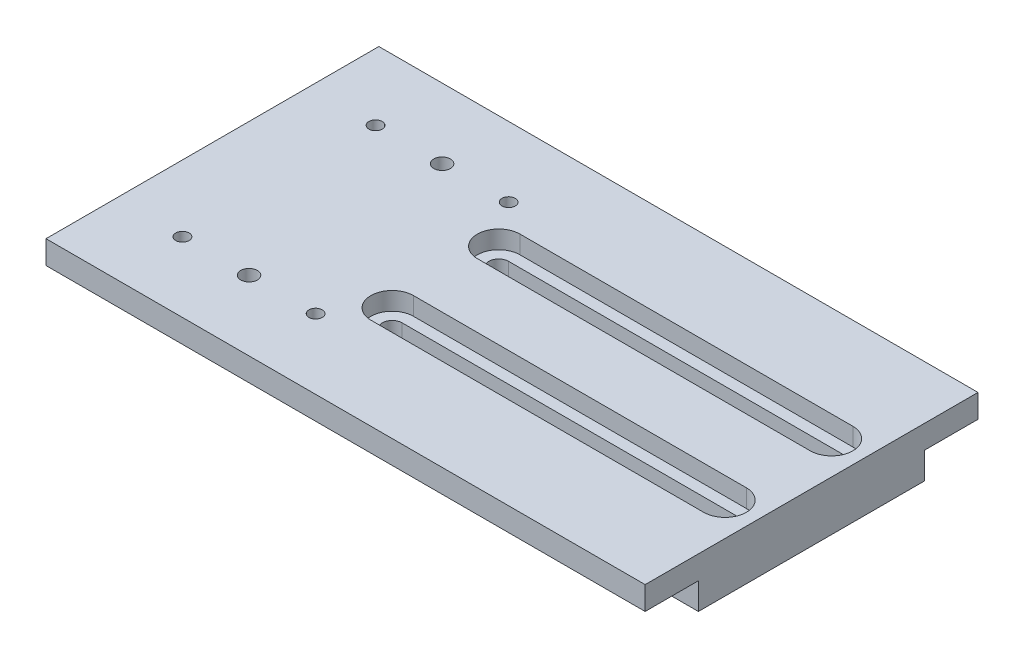
ISO-10303-21;
HEADER;
FILE_DESCRIPTION(('STEP AP214'),'2;1');
FILE_NAME('part.step','',(''),(''),'','','');
FILE_SCHEMA(('AUTOMOTIVE_DESIGN { 1 0 10303 214 1 1 1 1 }'));
ENDSEC;
DATA;
#1=APPLICATION_CONTEXT('core data for automotive mechanical design processes');
#2=APPLICATION_PROTOCOL_DEFINITION('international standard','automotive_design',2000,#1);
#3=PRODUCT_CONTEXT('',#1,'mechanical');
#4=PRODUCT('Part','Part','',(#3));
#5=PRODUCT_RELATED_PRODUCT_CATEGORY('part','',(#4));
#6=PRODUCT_DEFINITION_FORMATION('','',#4);
#7=PRODUCT_DEFINITION_CONTEXT('part definition',#1,'design');
#8=PRODUCT_DEFINITION('design','',#6,#7);
#9=PRODUCT_DEFINITION_SHAPE('','',#8);
#10=(LENGTH_UNIT() NAMED_UNIT(*) SI_UNIT(.MILLI.,.METRE.));
#11=(NAMED_UNIT(*) PLANE_ANGLE_UNIT() SI_UNIT($,.RADIAN.));
#12=(NAMED_UNIT(*) SI_UNIT($,.STERADIAN.) SOLID_ANGLE_UNIT());
#13=UNCERTAINTY_MEASURE_WITH_UNIT(LENGTH_MEASURE(1.E-05),#10,'distance_accuracy_value','');
#14=(GEOMETRIC_REPRESENTATION_CONTEXT(3) GLOBAL_UNCERTAINTY_ASSIGNED_CONTEXT((#13)) GLOBAL_UNIT_ASSIGNED_CONTEXT((#10,
#11,#12)) REPRESENTATION_CONTEXT('',''));
#15=CARTESIAN_POINT('',(0.,0.,0.));
#16=DIRECTION('',(0.,0.,1.));
#17=DIRECTION('',(1.,0.,0.));
#18=AXIS2_PLACEMENT_3D('',#15,#16,#17);
#19=CARTESIAN_POINT('',(0.,7.5,0.));
#20=DIRECTION('',(0.,-1.,0.));
#21=DIRECTION('',(0.,0.,-1.));
#22=AXIS2_PLACEMENT_3D('',#19,#20,#21);
#23=PLANE('',#22);
#24=CARTESIAN_POINT('',(-25.,7.5,-14.5));
#25=DIRECTION('',(0.,1.,0.));
#26=DIRECTION('',(0.,0.,1.));
#27=AXIS2_PLACEMENT_3D('',#24,#25,#26);
#28=CIRCLE('',#27,1.24999999999999);
#29=CARTESIAN_POINT('',(-25.,7.5,-13.25));
#30=VERTEX_POINT('',#29);
#31=EDGE_CURVE('E886',#30,#30,#28,.T.);
#32=ORIENTED_EDGE('',*,*,#31,.F.);
#33=EDGE_LOOP('',(#32));
#34=FACE_BOUND('',#33,.T.);
#35=DIRECTION('',(1.,0.,0.));
#36=VECTOR('',#35,1.);
#37=CARTESIAN_POINT('',(-9.99999999999999,7.5,-4.8));
#38=LINE('',#37,#36);
#39=CARTESIAN_POINT('',(-9.99999999999999,7.5,-4.8));
#40=VERTEX_POINT('',#39);
#41=CARTESIAN_POINT('',(40.,7.5,-4.79999999999999));
#42=VERTEX_POINT('',#41);
#43=EDGE_CURVE('E283',#40,#42,#38,.T.);
#44=ORIENTED_EDGE('',*,*,#43,.F.);
#45=CARTESIAN_POINT('',(-9.99999999999999,7.5,-8.));
#46=DIRECTION('',(0.,1.,0.));
#47=DIRECTION('',(0.,0.,1.));
#48=AXIS2_PLACEMENT_3D('',#45,#46,#47);
#49=CIRCLE('',#48,3.2);
#50=CARTESIAN_POINT('',(-9.99999999999999,7.5,-11.2));
#51=VERTEX_POINT('',#50);
#52=EDGE_CURVE('E280',#51,#40,#49,.T.);
#53=ORIENTED_EDGE('',*,*,#52,.F.);
#54=DIRECTION('',(-1.,0.,0.));
#55=VECTOR('',#54,1.);
#56=CARTESIAN_POINT('',(-9.99999999999999,7.5,-11.2));
#57=LINE('',#56,#55);
#58=CARTESIAN_POINT('',(40.,7.5,-11.2));
#59=VERTEX_POINT('',#58);
#60=EDGE_CURVE('E267',#59,#51,#57,.T.);
#61=ORIENTED_EDGE('',*,*,#60,.F.);
#62=CARTESIAN_POINT('',(40.,7.5,-7.99999999999999));
#63=DIRECTION('',(0.,1.,0.));
#64=DIRECTION('',(0.,0.,1.));
#65=AXIS2_PLACEMENT_3D('',#62,#63,#64);
#66=CIRCLE('',#65,3.2);
#67=EDGE_CURVE('E288',#42,#59,#66,.T.);
#68=ORIENTED_EDGE('',*,*,#67,.F.);
#69=EDGE_LOOP('',(#44,#53,#61,#68));
#70=FACE_BOUND('',#69,.T.);
#71=DIRECTION('',(1.,0.,0.));
#72=VECTOR('',#71,1.);
#73=CARTESIAN_POINT('',(-9.99999999999999,7.5,11.2));
#74=LINE('',#73,#72);
#75=CARTESIAN_POINT('',(-9.99999999999999,7.5,11.2));
#76=VERTEX_POINT('',#75);
#77=CARTESIAN_POINT('',(40.,7.5,11.2));
#78=VERTEX_POINT('',#77);
#79=EDGE_CURVE('E328',#76,#78,#74,.T.);
#80=ORIENTED_EDGE('',*,*,#79,.F.);
#81=CARTESIAN_POINT('',(-9.99999999999999,7.5,8.));
#82=DIRECTION('',(0.,1.,0.));
#83=DIRECTION('',(0.,0.,-1.));
#84=AXIS2_PLACEMENT_3D('',#81,#82,#83);
#85=CIRCLE('',#84,3.2);
#86=CARTESIAN_POINT('',(-9.99999999999999,7.5,4.8));
#87=VERTEX_POINT('',#86);
#88=EDGE_CURVE('E261',#87,#76,#85,.T.);
#89=ORIENTED_EDGE('',*,*,#88,.F.);
#90=DIRECTION('',(-1.,0.,0.));
#91=VECTOR('',#90,1.);
#92=CARTESIAN_POINT('',(-9.99999999999999,7.5,4.8));
#93=LINE('',#92,#91);
#94=CARTESIAN_POINT('',(40.,7.5,4.79999999999999));
#95=VERTEX_POINT('',#94);
#96=EDGE_CURVE('E313',#95,#87,#93,.T.);
#97=ORIENTED_EDGE('',*,*,#96,.F.);
#98=CARTESIAN_POINT('',(40.,7.5,7.99999999999999));
#99=DIRECTION('',(0.,1.,0.));
#100=DIRECTION('',(0.,0.,-1.));
#101=AXIS2_PLACEMENT_3D('',#98,#99,#100);
#102=CIRCLE('',#101,3.2);
#103=EDGE_CURVE('E332',#78,#95,#102,.T.);
#104=ORIENTED_EDGE('',*,*,#103,.F.);
#105=EDGE_LOOP('',(#80,#89,#97,#104));
#106=FACE_BOUND('',#105,.T.);
#107=CARTESIAN_POINT('',(-35.,7.5,-14.5));
#108=DIRECTION('',(0.,1.,0.));
#109=DIRECTION('',(0.,0.,1.));
#110=AXIS2_PLACEMENT_3D('',#107,#108,#109);
#111=CIRCLE('',#110,0.999999999999998);
#112=CARTESIAN_POINT('',(-35.,7.5,-13.5));
#113=VERTEX_POINT('',#112);
#114=EDGE_CURVE('E375',#113,#113,#111,.T.);
#115=ORIENTED_EDGE('',*,*,#114,.F.);
#116=EDGE_LOOP('',(#115));
#117=FACE_BOUND('',#116,.T.);
#118=CARTESIAN_POINT('',(-15.,7.5,14.5));
#119=DIRECTION('',(0.,1.,0.));
#120=DIRECTION('',(0.,0.,-1.));
#121=AXIS2_PLACEMENT_3D('',#118,#119,#120);
#122=CIRCLE('',#121,1.);
#123=CARTESIAN_POINT('',(-15.,7.5,13.5));
#124=VERTEX_POINT('',#123);
#125=EDGE_CURVE('E424',#124,#124,#122,.T.);
#126=ORIENTED_EDGE('',*,*,#125,.F.);
#127=EDGE_LOOP('',(#126));
#128=FACE_BOUND('',#127,.T.);
#129=CARTESIAN_POINT('',(-15.,7.5,-14.5));
#130=DIRECTION('',(0.,1.,0.));
#131=DIRECTION('',(0.,0.,1.));
#132=AXIS2_PLACEMENT_3D('',#129,#130,#131);
#133=CIRCLE('',#132,1.);
#134=CARTESIAN_POINT('',(-15.,7.5,-13.5));
#135=VERTEX_POINT('',#134);
#136=EDGE_CURVE('E370',#135,#135,#133,.T.);
#137=ORIENTED_EDGE('',*,*,#136,.F.);
#138=EDGE_LOOP('',(#137));
#139=FACE_BOUND('',#138,.T.);
#140=CARTESIAN_POINT('',(-35.,7.5,14.5));
#141=DIRECTION('',(0.,1.,0.));
#142=DIRECTION('',(0.,0.,-1.));
#143=AXIS2_PLACEMENT_3D('',#140,#141,#142);
#144=CIRCLE('',#143,0.999999999999998);
#145=CARTESIAN_POINT('',(-35.,7.5,13.5));
#146=VERTEX_POINT('',#145);
#147=EDGE_CURVE('E423',#146,#146,#144,.T.);
#148=ORIENTED_EDGE('',*,*,#147,.F.);
#149=EDGE_LOOP('',(#148));
#150=FACE_BOUND('',#149,.T.);
#151=DIRECTION('',(0.,0.,-1.));
#152=VECTOR('',#151,1.);
#153=CARTESIAN_POINT('',(45.,7.5,25.));
#154=LINE('',#153,#152);
#155=CARTESIAN_POINT('',(45.,7.5,25.));
#156=VERTEX_POINT('',#155);
#157=CARTESIAN_POINT('',(45.,7.5,-25.));
#158=VERTEX_POINT('',#157);
#159=EDGE_CURVE('E466',#156,#158,#154,.T.);
#160=ORIENTED_EDGE('',*,*,#159,.T.);
#161=DIRECTION('',(-1.,0.,0.));
#162=VECTOR('',#161,1.);
#163=CARTESIAN_POINT('',(-45.,7.5,-25.));
#164=LINE('',#163,#162);
#165=CARTESIAN_POINT('',(-45.,7.5,-25.));
#166=VERTEX_POINT('',#165);
#167=EDGE_CURVE('E470',#158,#166,#164,.T.);
#168=ORIENTED_EDGE('',*,*,#167,.T.);
#169=DIRECTION('',(0.,0.,1.));
#170=VECTOR('',#169,1.);
#171=CARTESIAN_POINT('',(-45.,7.5,25.));
#172=LINE('',#171,#170);
#173=CARTESIAN_POINT('',(-45.,7.5,25.));
#174=VERTEX_POINT('',#173);
#175=EDGE_CURVE('E474',#166,#174,#172,.T.);
#176=ORIENTED_EDGE('',*,*,#175,.T.);
#177=DIRECTION('',(1.,0.,0.));
#178=VECTOR('',#177,1.);
#179=CARTESIAN_POINT('',(-45.,7.5,25.));
#180=LINE('',#179,#178);
#181=EDGE_CURVE('E477',#174,#156,#180,.T.);
#182=ORIENTED_EDGE('',*,*,#181,.T.);
#183=EDGE_LOOP('',(#160,#168,#176,#182));
#184=FACE_BOUND('',#183,.T.);
#185=CARTESIAN_POINT('',(-25.,7.5,14.5));
#186=DIRECTION('',(0.,1.,0.));
#187=DIRECTION('',(0.,0.,1.));
#188=AXIS2_PLACEMENT_3D('',#185,#186,#187);
#189=CIRCLE('',#188,1.24999999999999);
#190=CARTESIAN_POINT('',(-25.,7.5,15.75));
#191=VERTEX_POINT('',#190);
#192=EDGE_CURVE('E890',#191,#191,#189,.T.);
#193=ORIENTED_EDGE('',*,*,#192,.F.);
#194=EDGE_LOOP('',(#193));
#195=FACE_BOUND('',#194,.T.);
#196=ADVANCED_FACE('F43',(#34,#70,#106,#117,#128,#139,#150,#184,#195),#23,.F.);
#197=CARTESIAN_POINT('',(-9.99999999999999,0.,-8.));
#198=DIRECTION('',(0.,1.,0.));
#199=DIRECTION('',(0.,0.,1.));
#200=AXIS2_PLACEMENT_3D('',#197,#198,#199);
#201=CYLINDRICAL_SURFACE('',#200,1.5);
#202=CARTESIAN_POINT('',(-9.99999999999999,4.8,-8.));
#203=DIRECTION('',(0.,1.,0.));
#204=DIRECTION('',(0.,0.,1.));
#205=AXIS2_PLACEMENT_3D('',#202,#203,#204);
#206=CIRCLE('',#205,1.5);
#207=CARTESIAN_POINT('',(-9.99999999999999,4.8,-6.5));
#208=VERTEX_POINT('',#207);
#209=CARTESIAN_POINT('',(-9.99999999999999,4.8,-9.5));
#210=VERTEX_POINT('',#209);
#211=EDGE_CURVE('E367',#208,#210,#206,.F.);
#212=ORIENTED_EDGE('',*,*,#211,.F.);
#213=DIRECTION('',(0.,1.,0.));
#214=VECTOR('',#213,1.);
#215=CARTESIAN_POINT('',(-9.99999999999999,0.,-6.5));
#216=LINE('',#215,#214);
#217=CARTESIAN_POINT('',(-9.99999999999999,0.,-6.5));
#218=VERTEX_POINT('',#217);
#219=EDGE_CURVE('E444',#218,#208,#216,.T.);
#220=ORIENTED_EDGE('',*,*,#219,.F.);
#221=CARTESIAN_POINT('',(-9.99999999999999,0.,-8.));
#222=DIRECTION('',(0.,1.,0.));
#223=DIRECTION('',(0.,0.,1.));
#224=AXIS2_PLACEMENT_3D('',#221,#222,#223);
#225=CIRCLE('',#224,1.5);
#226=CARTESIAN_POINT('',(-9.99999999999999,0.,-9.5));
#227=VERTEX_POINT('',#226);
#228=EDGE_CURVE('E401',#227,#218,#225,.T.);
#229=ORIENTED_EDGE('',*,*,#228,.F.);
#230=DIRECTION('',(0.,1.,0.));
#231=VECTOR('',#230,1.);
#232=CARTESIAN_POINT('',(-9.99999999999999,0.,-9.5));
#233=LINE('',#232,#231);
#234=EDGE_CURVE('E428',#227,#210,#233,.T.);
#235=ORIENTED_EDGE('',*,*,#234,.T.);
#236=EDGE_LOOP('',(#212,#220,#229,#235));
#237=FACE_BOUND('',#236,.T.);
#238=ADVANCED_FACE('F513',(#237),#201,.F.);
#239=CARTESIAN_POINT('',(-9.99999999999999,0.,-9.5));
#240=DIRECTION('',(0.,0.,-1.));
#241=DIRECTION('',(-1.,0.,0.));
#242=AXIS2_PLACEMENT_3D('',#239,#240,#241);
#243=PLANE('',#242);
#244=DIRECTION('',(1.,0.,0.));
#245=VECTOR('',#244,1.);
#246=CARTESIAN_POINT('',(-9.99999999999999,4.8,-9.5));
#247=LINE('',#246,#245);
#248=CARTESIAN_POINT('',(40.,4.8,-9.49999999999997));
#249=VERTEX_POINT('',#248);
#250=EDGE_CURVE('E364',#210,#249,#247,.T.);
#251=ORIENTED_EDGE('',*,*,#250,.F.);
#252=ORIENTED_EDGE('',*,*,#234,.F.);
#253=DIRECTION('',(-1.,0.,0.));
#254=VECTOR('',#253,1.);
#255=CARTESIAN_POINT('',(-9.99999999999999,0.,-9.5));
#256=LINE('',#255,#254);
#257=CARTESIAN_POINT('',(40.,0.,-9.49999999999999));
#258=VERTEX_POINT('',#257);
#259=EDGE_CURVE('E440',#258,#227,#256,.T.);
#260=ORIENTED_EDGE('',*,*,#259,.F.);
#261=DIRECTION('',(0.,1.,0.));
#262=VECTOR('',#261,1.);
#263=CARTESIAN_POINT('',(40.,0.,-9.49999999999999));
#264=LINE('',#263,#262);
#265=EDGE_CURVE('E448',#258,#249,#264,.T.);
#266=ORIENTED_EDGE('',*,*,#265,.T.);
#267=EDGE_LOOP('',(#251,#252,#260,#266));
#268=FACE_BOUND('',#267,.T.);
#269=ADVANCED_FACE('F522',(#268),#243,.F.);
#270=CARTESIAN_POINT('',(40.,0.,-7.99999999999999));
#271=DIRECTION('',(0.,1.,0.));
#272=DIRECTION('',(0.,0.,1.));
#273=AXIS2_PLACEMENT_3D('',#270,#271,#272);
#274=CYLINDRICAL_SURFACE('',#273,1.49999999999998);
#275=CARTESIAN_POINT('',(40.,4.8,-7.99999999999999));
#276=DIRECTION('',(0.,1.,0.));
#277=DIRECTION('',(0.,0.,1.));
#278=AXIS2_PLACEMENT_3D('',#275,#276,#277);
#279=CIRCLE('',#278,1.49999999999998);
#280=CARTESIAN_POINT('',(40.,4.8,-6.50000000000001));
#281=VERTEX_POINT('',#280);
#282=EDGE_CURVE('E361',#249,#281,#279,.F.);
#283=ORIENTED_EDGE('',*,*,#282,.F.);
#284=ORIENTED_EDGE('',*,*,#265,.F.);
#285=CARTESIAN_POINT('',(40.,0.,-7.99999999999999));
#286=DIRECTION('',(0.,1.,0.));
#287=DIRECTION('',(0.,0.,1.));
#288=AXIS2_PLACEMENT_3D('',#285,#286,#287);
#289=CIRCLE('',#288,1.49999999999998);
#290=CARTESIAN_POINT('',(40.,0.,-6.50000000000002));
#291=VERTEX_POINT('',#290);
#292=EDGE_CURVE('E436',#291,#258,#289,.T.);
#293=ORIENTED_EDGE('',*,*,#292,.F.);
#294=DIRECTION('',(0.,1.,0.));
#295=VECTOR('',#294,1.);
#296=CARTESIAN_POINT('',(40.,0.,-6.50000000000001));
#297=LINE('',#296,#295);
#298=EDGE_CURVE('E452',#291,#281,#297,.T.);
#299=ORIENTED_EDGE('',*,*,#298,.T.);
#300=EDGE_LOOP('',(#283,#284,#293,#299));
#301=FACE_BOUND('',#300,.T.);
#302=ADVANCED_FACE('F524',(#301),#274,.F.);
#303=CARTESIAN_POINT('',(-9.99999999999999,0.,-6.5));
#304=DIRECTION('',(0.,0.,1.));
#305=DIRECTION('',(1.,0.,0.));
#306=AXIS2_PLACEMENT_3D('',#303,#304,#305);
#307=PLANE('',#306);
#308=DIRECTION('',(-1.,0.,0.));
#309=VECTOR('',#308,1.);
#310=CARTESIAN_POINT('',(-9.99999999999999,4.8,-6.5));
#311=LINE('',#310,#309);
#312=EDGE_CURVE('E52',#281,#208,#311,.T.);
#313=ORIENTED_EDGE('',*,*,#312,.F.);
#314=ORIENTED_EDGE('',*,*,#298,.F.);
#315=DIRECTION('',(1.,0.,0.));
#316=VECTOR('',#315,1.);
#317=CARTESIAN_POINT('',(-9.99999999999999,0.,-6.5));
#318=LINE('',#317,#316);
#319=EDGE_CURVE('E432',#218,#291,#318,.T.);
#320=ORIENTED_EDGE('',*,*,#319,.F.);
#321=ORIENTED_EDGE('',*,*,#219,.T.);
#322=EDGE_LOOP('',(#313,#314,#320,#321));
#323=FACE_BOUND('',#322,.T.);
#324=ADVANCED_FACE('F516',(#323),#307,.F.);
#325=CARTESIAN_POINT('',(45.,7.5,25.));
#326=DIRECTION('',(-1.,0.,0.));
#327=DIRECTION('',(0.,0.,1.));
#328=AXIS2_PLACEMENT_3D('',#325,#326,#327);
#329=PLANE('',#328);
#330=DIRECTION('',(0.,0.,-1.));
#331=VECTOR('',#330,1.);
#332=CARTESIAN_POINT('',(45.,0.,25.));
#333=LINE('',#332,#331);
#334=CARTESIAN_POINT('',(45.,0.,17.));
#335=VERTEX_POINT('',#334);
#336=CARTESIAN_POINT('',(45.,0.,-17.));
#337=VERTEX_POINT('',#336);
#338=EDGE_CURVE('E227',#335,#337,#333,.T.);
#339=ORIENTED_EDGE('',*,*,#338,.T.);
#340=DIRECTION('',(0.,1.,0.));
#341=VECTOR('',#340,1.);
#342=CARTESIAN_POINT('',(45.,0.,-17.));
#343=LINE('',#342,#341);
#344=CARTESIAN_POINT('',(45.,4.,-17.));
#345=VERTEX_POINT('',#344);
#346=EDGE_CURVE('E67',#337,#345,#343,.T.);
#347=ORIENTED_EDGE('',*,*,#346,.T.);
#348=DIRECTION('',(0.,0.,-1.));
#349=VECTOR('',#348,1.);
#350=CARTESIAN_POINT('',(45.,4.,-17.));
#351=LINE('',#350,#349);
#352=CARTESIAN_POINT('',(45.,4.,-25.));
#353=VERTEX_POINT('',#352);
#354=EDGE_CURVE('E213',#345,#353,#351,.T.);
#355=ORIENTED_EDGE('',*,*,#354,.T.);
#356=DIRECTION('',(0.,-1.,0.));
#357=VECTOR('',#356,1.);
#358=CARTESIAN_POINT('',(45.,7.5,-25.));
#359=LINE('',#358,#357);
#360=EDGE_CURVE('E497',#158,#353,#359,.T.);
#361=ORIENTED_EDGE('',*,*,#360,.F.);
#362=ORIENTED_EDGE('',*,*,#159,.F.);
#363=DIRECTION('',(0.,-1.,0.));
#364=VECTOR('',#363,1.);
#365=CARTESIAN_POINT('',(45.,7.5,25.));
#366=LINE('',#365,#364);
#367=CARTESIAN_POINT('',(45.,4.,25.));
#368=VERTEX_POINT('',#367);
#369=EDGE_CURVE('E480',#156,#368,#366,.T.);
#370=ORIENTED_EDGE('',*,*,#369,.T.);
#371=DIRECTION('',(0.,0.,-1.));
#372=VECTOR('',#371,1.);
#373=CARTESIAN_POINT('',(45.,4.,17.));
#374=LINE('',#373,#372);
#375=CARTESIAN_POINT('',(45.,4.,17.));
#376=VERTEX_POINT('',#375);
#377=EDGE_CURVE('E242',#368,#376,#374,.T.);
#378=ORIENTED_EDGE('',*,*,#377,.T.);
#379=DIRECTION('',(0.,-1.,0.));
#380=VECTOR('',#379,1.);
#381=CARTESIAN_POINT('',(45.,0.,17.));
#382=LINE('',#381,#380);
#383=EDGE_CURVE('E246',#376,#335,#382,.T.);
#384=ORIENTED_EDGE('',*,*,#383,.T.);
#385=EDGE_LOOP('',(#339,#347,#355,#361,#362,#370,#378,#384));
#386=FACE_BOUND('',#385,.T.);
#387=ADVANCED_FACE('F45',(#386),#329,.F.);
#388=CARTESIAN_POINT('',(-45.,7.5,-25.));
#389=DIRECTION('',(0.,0.,1.));
#390=DIRECTION('',(1.,0.,0.));
#391=AXIS2_PLACEMENT_3D('',#388,#389,#390);
#392=PLANE('',#391);
#393=ORIENTED_EDGE('',*,*,#360,.T.);
#394=DIRECTION('',(-1.,0.,0.));
#395=VECTOR('',#394,1.);
#396=CARTESIAN_POINT('',(-45.,4.,-25.));
#397=LINE('',#396,#395);
#398=CARTESIAN_POINT('',(-45.,4.,-25.));
#399=VERTEX_POINT('',#398);
#400=EDGE_CURVE('E218',#353,#399,#397,.T.);
#401=ORIENTED_EDGE('',*,*,#400,.T.);
#402=DIRECTION('',(0.,-1.,0.));
#403=VECTOR('',#402,1.);
#404=CARTESIAN_POINT('',(-45.,7.5,-25.));
#405=LINE('',#404,#403);
#406=EDGE_CURVE('E493',#166,#399,#405,.T.);
#407=ORIENTED_EDGE('',*,*,#406,.F.);
#408=ORIENTED_EDGE('',*,*,#167,.F.);
#409=EDGE_LOOP('',(#393,#401,#407,#408));
#410=FACE_BOUND('',#409,.T.);
#411=ADVANCED_FACE('F554',(#410),#392,.F.);
#412=CARTESIAN_POINT('',(-45.,7.5,25.));
#413=DIRECTION('',(1.,0.,0.));
#414=DIRECTION('',(0.,0.,-1.));
#415=AXIS2_PLACEMENT_3D('',#412,#413,#414);
#416=PLANE('',#415);
#417=DIRECTION('',(0.,0.,-1.));
#418=VECTOR('',#417,1.);
#419=CARTESIAN_POINT('',(-45.,4.,-17.));
#420=LINE('',#419,#418);
#421=CARTESIAN_POINT('',(-45.,4.,-17.));
#422=VERTEX_POINT('',#421);
#423=EDGE_CURVE('E229',#422,#399,#420,.T.);
#424=ORIENTED_EDGE('',*,*,#423,.F.);
#425=DIRECTION('',(0.,1.,0.));
#426=VECTOR('',#425,1.);
#427=CARTESIAN_POINT('',(-45.,0.,-17.));
#428=LINE('',#427,#426);
#429=CARTESIAN_POINT('',(-45.,0.,-17.));
#430=VERTEX_POINT('',#429);
#431=EDGE_CURVE('E208',#430,#422,#428,.T.);
#432=ORIENTED_EDGE('',*,*,#431,.F.);
#433=DIRECTION('',(0.,0.,1.));
#434=VECTOR('',#433,1.);
#435=CARTESIAN_POINT('',(-45.,0.,25.));
#436=LINE('',#435,#434);
#437=CARTESIAN_POINT('',(-45.,0.,17.));
#438=VERTEX_POINT('',#437);
#439=EDGE_CURVE('E471',#430,#438,#436,.T.);
#440=ORIENTED_EDGE('',*,*,#439,.T.);
#441=DIRECTION('',(0.,-1.,0.));
#442=VECTOR('',#441,1.);
#443=CARTESIAN_POINT('',(-45.,0.,17.));
#444=LINE('',#443,#442);
#445=CARTESIAN_POINT('',(-45.,4.,17.));
#446=VERTEX_POINT('',#445);
#447=EDGE_CURVE('E59',#446,#438,#444,.T.);
#448=ORIENTED_EDGE('',*,*,#447,.F.);
#449=DIRECTION('',(0.,0.,-1.));
#450=VECTOR('',#449,1.);
#451=CARTESIAN_POINT('',(-45.,4.,17.));
#452=LINE('',#451,#450);
#453=CARTESIAN_POINT('',(-45.,4.,25.));
#454=VERTEX_POINT('',#453);
#455=EDGE_CURVE('E250',#454,#446,#452,.T.);
#456=ORIENTED_EDGE('',*,*,#455,.F.);
#457=DIRECTION('',(0.,-1.,0.));
#458=VECTOR('',#457,1.);
#459=CARTESIAN_POINT('',(-45.,7.5,25.));
#460=LINE('',#459,#458);
#461=EDGE_CURVE('E489',#174,#454,#460,.T.);
#462=ORIENTED_EDGE('',*,*,#461,.F.);
#463=ORIENTED_EDGE('',*,*,#175,.F.);
#464=ORIENTED_EDGE('',*,*,#406,.T.);
#465=EDGE_LOOP('',(#424,#432,#440,#448,#456,#462,#463,#464));
#466=FACE_BOUND('',#465,.T.);
#467=ADVANCED_FACE('F551',(#466),#416,.F.);
#468=CARTESIAN_POINT('',(-45.,7.5,25.));
#469=DIRECTION('',(0.,0.,-1.));
#470=DIRECTION('',(-1.,0.,0.));
#471=AXIS2_PLACEMENT_3D('',#468,#469,#470);
#472=PLANE('',#471);
#473=ORIENTED_EDGE('',*,*,#461,.T.);
#474=DIRECTION('',(1.,0.,0.));
#475=VECTOR('',#474,1.);
#476=CARTESIAN_POINT('',(-45.,4.,25.));
#477=LINE('',#476,#475);
#478=EDGE_CURVE('E11',#454,#368,#477,.T.);
#479=ORIENTED_EDGE('',*,*,#478,.T.);
#480=ORIENTED_EDGE('',*,*,#369,.F.);
#481=ORIENTED_EDGE('',*,*,#181,.F.);
#482=EDGE_LOOP('',(#473,#479,#480,#481));
#483=FACE_BOUND('',#482,.T.);
#484=ADVANCED_FACE('F547',(#483),#472,.F.);
#485=CARTESIAN_POINT('',(0.,0.,0.));
#486=DIRECTION('',(0.,-1.,0.));
#487=DIRECTION('',(0.,0.,-1.));
#488=AXIS2_PLACEMENT_3D('',#485,#486,#487);
#489=PLANE('',#488);
#490=CARTESIAN_POINT('',(-25.,0.,-14.5));
#491=DIRECTION('',(0.,1.,0.));
#492=DIRECTION('',(0.,0.,1.));
#493=AXIS2_PLACEMENT_3D('',#490,#491,#492);
#494=CIRCLE('',#493,1.25);
#495=CARTESIAN_POINT('',(-25.,0.,-13.25));
#496=VERTEX_POINT('',#495);
#497=EDGE_CURVE('E884',#496,#496,#494,.T.);
#498=ORIENTED_EDGE('',*,*,#497,.T.);
#499=EDGE_LOOP('',(#498));
#500=FACE_BOUND('',#499,.T.);
#501=CARTESIAN_POINT('',(-25.,0.,14.5));
#502=DIRECTION('',(0.,1.,0.));
#503=DIRECTION('',(0.,0.,1.));
#504=AXIS2_PLACEMENT_3D('',#501,#502,#503);
#505=CIRCLE('',#504,1.25);
#506=CARTESIAN_POINT('',(-25.,0.,15.75));
#507=VERTEX_POINT('',#506);
#508=EDGE_CURVE('E234',#507,#507,#505,.T.);
#509=ORIENTED_EDGE('',*,*,#508,.T.);
#510=EDGE_LOOP('',(#509));
#511=FACE_BOUND('',#510,.T.);
#512=DIRECTION('',(-1.,0.,0.));
#513=VECTOR('',#512,1.);
#514=CARTESIAN_POINT('',(45.,0.,-17.));
#515=LINE('',#514,#513);
#516=EDGE_CURVE('E212',#337,#430,#515,.T.);
#517=ORIENTED_EDGE('',*,*,#516,.F.);
#518=ORIENTED_EDGE('',*,*,#338,.F.);
#519=DIRECTION('',(-1.,0.,0.));
#520=VECTOR('',#519,1.);
#521=CARTESIAN_POINT('',(45.,0.,17.));
#522=LINE('',#521,#520);
#523=EDGE_CURVE('E238',#335,#438,#522,.T.);
#524=ORIENTED_EDGE('',*,*,#523,.T.);
#525=ORIENTED_EDGE('',*,*,#439,.F.);
#526=EDGE_LOOP('',(#517,#518,#524,#525));
#527=FACE_BOUND('',#526,.T.);
#528=CARTESIAN_POINT('',(-35.,0.,-14.5));
#529=DIRECTION('',(0.,1.,0.));
#530=DIRECTION('',(0.,0.,1.));
#531=AXIS2_PLACEMENT_3D('',#528,#529,#530);
#532=CIRCLE('',#531,0.999999999999998);
#533=CARTESIAN_POINT('',(-35.,0.,-13.5));
#534=VERTEX_POINT('',#533);
#535=EDGE_CURVE('E384',#534,#534,#532,.T.);
#536=ORIENTED_EDGE('',*,*,#535,.T.);
#537=EDGE_LOOP('',(#536));
#538=FACE_BOUND('',#537,.T.);
#539=CARTESIAN_POINT('',(-9.99999999999999,0.,8.));
#540=DIRECTION('',(0.,1.,0.));
#541=DIRECTION('',(0.,0.,-1.));
#542=AXIS2_PLACEMENT_3D('',#539,#540,#541);
#543=CIRCLE('',#542,1.5);
#544=CARTESIAN_POINT('',(-9.99999999999999,0.,6.5));
#545=VERTEX_POINT('',#544);
#546=CARTESIAN_POINT('',(-9.99999999999999,0.,9.50000000000001));
#547=VERTEX_POINT('',#546);
#548=EDGE_CURVE('E379',#545,#547,#543,.T.);
#549=ORIENTED_EDGE('',*,*,#548,.T.);
#550=DIRECTION('',(1.,0.,0.));
#551=VECTOR('',#550,1.);
#552=CARTESIAN_POINT('',(-9.99999999999999,0.,9.50000000000001));
#553=LINE('',#552,#551);
#554=CARTESIAN_POINT('',(40.,0.,9.49999999999998));
#555=VERTEX_POINT('',#554);
#556=EDGE_CURVE('E383',#547,#555,#553,.T.);
#557=ORIENTED_EDGE('',*,*,#556,.T.);
#558=CARTESIAN_POINT('',(40.,0.,7.99999999999998));
#559=DIRECTION('',(0.,1.,0.));
#560=DIRECTION('',(0.,0.,-1.));
#561=AXIS2_PLACEMENT_3D('',#558,#559,#560);
#562=CIRCLE('',#561,1.49999999999998);
#563=CARTESIAN_POINT('',(40.,0.,6.5));
#564=VERTEX_POINT('',#563);
#565=EDGE_CURVE('E388',#555,#564,#562,.T.);
#566=ORIENTED_EDGE('',*,*,#565,.T.);
#567=DIRECTION('',(-1.,0.,0.));
#568=VECTOR('',#567,1.);
#569=CARTESIAN_POINT('',(-9.99999999999999,0.,6.5));
#570=LINE('',#569,#568);
#571=EDGE_CURVE('E392',#564,#545,#570,.T.);
#572=ORIENTED_EDGE('',*,*,#571,.T.);
#573=EDGE_LOOP('',(#549,#557,#566,#572));
#574=FACE_BOUND('',#573,.T.);
#575=ORIENTED_EDGE('',*,*,#228,.T.);
#576=ORIENTED_EDGE('',*,*,#319,.T.);
#577=ORIENTED_EDGE('',*,*,#292,.T.);
#578=ORIENTED_EDGE('',*,*,#259,.T.);
#579=EDGE_LOOP('',(#575,#576,#577,#578));
#580=FACE_BOUND('',#579,.T.);
#581=CARTESIAN_POINT('',(-15.,0.,14.5));
#582=DIRECTION('',(0.,1.,0.));
#583=DIRECTION('',(0.,0.,-1.));
#584=AXIS2_PLACEMENT_3D('',#581,#582,#583);
#585=CIRCLE('',#584,1.);
#586=CARTESIAN_POINT('',(-15.,0.,13.5));
#587=VERTEX_POINT('',#586);
#588=EDGE_CURVE('E419',#587,#587,#585,.T.);
#589=ORIENTED_EDGE('',*,*,#588,.T.);
#590=EDGE_LOOP('',(#589));
#591=FACE_BOUND('',#590,.T.);
#592=CARTESIAN_POINT('',(-15.,0.,-14.5));
#593=DIRECTION('',(0.,1.,0.));
#594=DIRECTION('',(0.,0.,1.));
#595=AXIS2_PLACEMENT_3D('',#592,#593,#594);
#596=CIRCLE('',#595,1.);
#597=CARTESIAN_POINT('',(-15.,0.,-13.5));
#598=VERTEX_POINT('',#597);
#599=EDGE_CURVE('E371',#598,#598,#596,.T.);
#600=ORIENTED_EDGE('',*,*,#599,.T.);
#601=EDGE_LOOP('',(#600));
#602=FACE_BOUND('',#601,.T.);
#603=CARTESIAN_POINT('',(-35.,0.,14.5));
#604=DIRECTION('',(0.,1.,0.));
#605=DIRECTION('',(0.,0.,-1.));
#606=AXIS2_PLACEMENT_3D('',#603,#604,#605);
#607=CIRCLE('',#606,0.999999999999998);
#608=CARTESIAN_POINT('',(-35.,0.,13.5));
#609=VERTEX_POINT('',#608);
#610=EDGE_CURVE('E459',#609,#609,#607,.T.);
#611=ORIENTED_EDGE('',*,*,#610,.T.);
#612=EDGE_LOOP('',(#611));
#613=FACE_BOUND('',#612,.T.);
#614=ADVANCED_FACE('F518',(#500,#511,#527,#538,#574,#580,#591,#602,#613),#489,.T.);
#615=CARTESIAN_POINT('',(-35.,0.,14.5));
#616=DIRECTION('',(0.,1.,0.));
#617=DIRECTION('',(0.,0.,1.));
#618=AXIS2_PLACEMENT_3D('',#615,#616,#617);
#619=CYLINDRICAL_SURFACE('',#618,0.999999999999998);
#620=ORIENTED_EDGE('',*,*,#610,.F.);
#621=EDGE_LOOP('',(#620));
#622=FACE_BOUND('',#621,.T.);
#623=ORIENTED_EDGE('',*,*,#147,.T.);
#624=EDGE_LOOP('',(#623));
#625=FACE_BOUND('',#624,.T.);
#626=ADVANCED_FACE('F544',(#622,#625),#619,.F.);
#627=CARTESIAN_POINT('',(-15.,0.,-14.5));
#628=DIRECTION('',(0.,1.,0.));
#629=DIRECTION('',(0.,0.,1.));
#630=AXIS2_PLACEMENT_3D('',#627,#628,#629);
#631=CYLINDRICAL_SURFACE('',#630,1.);
#632=ORIENTED_EDGE('',*,*,#599,.F.);
#633=EDGE_LOOP('',(#632));
#634=FACE_BOUND('',#633,.T.);
#635=ORIENTED_EDGE('',*,*,#136,.T.);
#636=EDGE_LOOP('',(#635));
#637=FACE_BOUND('',#636,.T.);
#638=ADVANCED_FACE('F627',(#634,#637),#631,.F.);
#639=CARTESIAN_POINT('',(-15.,0.,14.5));
#640=DIRECTION('',(0.,1.,0.));
#641=DIRECTION('',(0.,0.,1.));
#642=AXIS2_PLACEMENT_3D('',#639,#640,#641);
#643=CYLINDRICAL_SURFACE('',#642,1.);
#644=ORIENTED_EDGE('',*,*,#588,.F.);
#645=EDGE_LOOP('',(#644));
#646=FACE_BOUND('',#645,.T.);
#647=ORIENTED_EDGE('',*,*,#125,.T.);
#648=EDGE_LOOP('',(#647));
#649=FACE_BOUND('',#648,.T.);
#650=ADVANCED_FACE('F630',(#646,#649),#643,.F.);
#651=CARTESIAN_POINT('',(-9.99999999999999,0.,8.));
#652=DIRECTION('',(0.,1.,0.));
#653=DIRECTION('',(0.,0.,1.));
#654=AXIS2_PLACEMENT_3D('',#651,#652,#653);
#655=CYLINDRICAL_SURFACE('',#654,1.5);
#656=DIRECTION('',(0.,1.,0.));
#657=VECTOR('',#656,1.);
#658=CARTESIAN_POINT('',(-9.99999999999999,0.,6.5));
#659=LINE('',#658,#657);
#660=CARTESIAN_POINT('',(-9.99999999999999,4.8,6.5));
#661=VERTEX_POINT('',#660);
#662=EDGE_CURVE('E397',#545,#661,#659,.T.);
#663=ORIENTED_EDGE('',*,*,#662,.T.);
#664=CARTESIAN_POINT('',(-9.99999999999999,4.8,8.));
#665=DIRECTION('',(0.,-1.,0.));
#666=DIRECTION('',(0.,0.,-1.));
#667=AXIS2_PLACEMENT_3D('',#664,#665,#666);
#668=CIRCLE('',#667,1.5);
#669=CARTESIAN_POINT('',(-9.99999999999999,4.8,9.50000000000001));
#670=VERTEX_POINT('',#669);
#671=EDGE_CURVE('E357',#661,#670,#668,.F.);
#672=ORIENTED_EDGE('',*,*,#671,.T.);
#673=DIRECTION('',(0.,1.,0.));
#674=VECTOR('',#673,1.);
#675=CARTESIAN_POINT('',(-9.99999999999999,0.,9.50000000000001));
#676=LINE('',#675,#674);
#677=EDGE_CURVE('E396',#547,#670,#676,.T.);
#678=ORIENTED_EDGE('',*,*,#677,.F.);
#679=ORIENTED_EDGE('',*,*,#548,.F.);
#680=EDGE_LOOP('',(#663,#672,#678,#679));
#681=FACE_BOUND('',#680,.T.);
#682=ADVANCED_FACE('F636',(#681),#655,.F.);
#683=CARTESIAN_POINT('',(-9.99999999999999,0.,6.5));
#684=DIRECTION('',(0.,0.,-1.));
#685=DIRECTION('',(-1.,0.,0.));
#686=AXIS2_PLACEMENT_3D('',#683,#684,#685);
#687=PLANE('',#686);
#688=DIRECTION('',(0.,1.,0.));
#689=VECTOR('',#688,1.);
#690=CARTESIAN_POINT('',(40.,0.,6.5));
#691=LINE('',#690,#689);
#692=CARTESIAN_POINT('',(40.,4.8,6.5));
#693=VERTEX_POINT('',#692);
#694=EDGE_CURVE('E402',#564,#693,#691,.T.);
#695=ORIENTED_EDGE('',*,*,#694,.T.);
#696=DIRECTION('',(-1.,0.,0.));
#697=VECTOR('',#696,1.);
#698=CARTESIAN_POINT('',(-9.99999999999999,4.8,6.5));
#699=LINE('',#698,#697);
#700=EDGE_CURVE('E353',#693,#661,#699,.T.);
#701=ORIENTED_EDGE('',*,*,#700,.T.);
#702=ORIENTED_EDGE('',*,*,#662,.F.);
#703=ORIENTED_EDGE('',*,*,#571,.F.);
#704=EDGE_LOOP('',(#695,#701,#702,#703));
#705=FACE_BOUND('',#704,.T.);
#706=ADVANCED_FACE('F632',(#705),#687,.F.);
#707=CARTESIAN_POINT('',(40.,0.,7.99999999999998));
#708=DIRECTION('',(0.,1.,0.));
#709=DIRECTION('',(0.,0.,1.));
#710=AXIS2_PLACEMENT_3D('',#707,#708,#709);
#711=CYLINDRICAL_SURFACE('',#710,1.49999999999998);
#712=DIRECTION('',(0.,1.,0.));
#713=VECTOR('',#712,1.);
#714=CARTESIAN_POINT('',(40.,0.,9.49999999999998));
#715=LINE('',#714,#713);
#716=CARTESIAN_POINT('',(40.,4.8,9.49999999999998));
#717=VERTEX_POINT('',#716);
#718=EDGE_CURVE('E406',#555,#717,#715,.T.);
#719=ORIENTED_EDGE('',*,*,#718,.T.);
#720=CARTESIAN_POINT('',(40.,4.8,7.99999999999998));
#721=DIRECTION('',(0.,-1.,0.));
#722=DIRECTION('',(0.,0.,-1.));
#723=AXIS2_PLACEMENT_3D('',#720,#721,#722);
#724=CIRCLE('',#723,1.49999999999998);
#725=EDGE_CURVE('E298',#717,#693,#724,.F.);
#726=ORIENTED_EDGE('',*,*,#725,.T.);
#727=ORIENTED_EDGE('',*,*,#694,.F.);
#728=ORIENTED_EDGE('',*,*,#565,.F.);
#729=EDGE_LOOP('',(#719,#726,#727,#728));
#730=FACE_BOUND('',#729,.T.);
#731=ADVANCED_FACE('F635',(#730),#711,.F.);
#732=CARTESIAN_POINT('',(-9.99999999999999,0.,9.50000000000001));
#733=DIRECTION('',(0.,0.,1.));
#734=DIRECTION('',(1.,0.,0.));
#735=AXIS2_PLACEMENT_3D('',#732,#733,#734);
#736=PLANE('',#735);
#737=ORIENTED_EDGE('',*,*,#677,.T.);
#738=DIRECTION('',(1.,0.,0.));
#739=VECTOR('',#738,1.);
#740=CARTESIAN_POINT('',(-9.99999999999999,4.8,9.50000000000001));
#741=LINE('',#740,#739);
#742=EDGE_CURVE('E500',#670,#717,#741,.T.);
#743=ORIENTED_EDGE('',*,*,#742,.T.);
#744=ORIENTED_EDGE('',*,*,#718,.F.);
#745=ORIENTED_EDGE('',*,*,#556,.F.);
#746=EDGE_LOOP('',(#737,#743,#744,#745));
#747=FACE_BOUND('',#746,.T.);
#748=ADVANCED_FACE('F640',(#747),#736,.F.);
#749=CARTESIAN_POINT('',(-35.,0.,-14.5));
#750=DIRECTION('',(0.,1.,0.));
#751=DIRECTION('',(0.,0.,1.));
#752=AXIS2_PLACEMENT_3D('',#749,#750,#751);
#753=CYLINDRICAL_SURFACE('',#752,0.999999999999998);
#754=ORIENTED_EDGE('',*,*,#535,.F.);
#755=EDGE_LOOP('',(#754));
#756=FACE_BOUND('',#755,.T.);
#757=ORIENTED_EDGE('',*,*,#114,.T.);
#758=EDGE_LOOP('',(#757));
#759=FACE_BOUND('',#758,.T.);
#760=ADVANCED_FACE('F611',(#756,#759),#753,.F.);
#761=CARTESIAN_POINT('',(-9.99999999999999,4.8,8.));
#762=DIRECTION('',(0.,-1.,0.));
#763=DIRECTION('',(0.,0.,-1.));
#764=AXIS2_PLACEMENT_3D('',#761,#762,#763);
#765=PLANE('',#764);
#766=CARTESIAN_POINT('',(-9.99999999999999,4.8,8.));
#767=DIRECTION('',(0.,1.,0.));
#768=DIRECTION('',(0.,0.,-1.));
#769=AXIS2_PLACEMENT_3D('',#766,#767,#768);
#770=CIRCLE('',#769,3.2);
#771=CARTESIAN_POINT('',(-9.99999999999999,4.8,4.8));
#772=VERTEX_POINT('',#771);
#773=CARTESIAN_POINT('',(-9.99999999999999,4.8,11.2));
#774=VERTEX_POINT('',#773);
#775=EDGE_CURVE('E308',#772,#774,#770,.T.);
#776=ORIENTED_EDGE('',*,*,#775,.T.);
#777=DIRECTION('',(1.,0.,0.));
#778=VECTOR('',#777,1.);
#779=CARTESIAN_POINT('',(-9.99999999999999,4.8,11.2));
#780=LINE('',#779,#778);
#781=CARTESIAN_POINT('',(40.,4.8,11.2));
#782=VERTEX_POINT('',#781);
#783=EDGE_CURVE('E312',#774,#782,#780,.T.);
#784=ORIENTED_EDGE('',*,*,#783,.T.);
#785=CARTESIAN_POINT('',(40.,4.8,7.99999999999999));
#786=DIRECTION('',(0.,1.,0.));
#787=DIRECTION('',(0.,0.,-1.));
#788=AXIS2_PLACEMENT_3D('',#785,#786,#787);
#789=CIRCLE('',#788,3.2);
#790=CARTESIAN_POINT('',(40.,4.8,4.79999999999999));
#791=VERTEX_POINT('',#790);
#792=EDGE_CURVE('E317',#782,#791,#789,.T.);
#793=ORIENTED_EDGE('',*,*,#792,.T.);
#794=DIRECTION('',(-1.,0.,0.));
#795=VECTOR('',#794,1.);
#796=CARTESIAN_POINT('',(-9.99999999999999,4.8,4.8));
#797=LINE('',#796,#795);
#798=EDGE_CURVE('E321',#791,#772,#797,.T.);
#799=ORIENTED_EDGE('',*,*,#798,.T.);
#800=EDGE_LOOP('',(#776,#784,#793,#799));
#801=FACE_BOUND('',#800,.T.);
#802=ORIENTED_EDGE('',*,*,#700,.F.);
#803=ORIENTED_EDGE('',*,*,#725,.F.);
#804=ORIENTED_EDGE('',*,*,#742,.F.);
#805=ORIENTED_EDGE('',*,*,#671,.F.);
#806=EDGE_LOOP('',(#802,#803,#804,#805));
#807=FACE_BOUND('',#806,.T.);
#808=ADVANCED_FACE('F607',(#801,#807),#765,.F.);
#809=CARTESIAN_POINT('',(-9.99999999999999,4.8,8.));
#810=DIRECTION('',(0.,1.,0.));
#811=DIRECTION('',(0.,0.,1.));
#812=AXIS2_PLACEMENT_3D('',#809,#810,#811);
#813=CYLINDRICAL_SURFACE('',#812,3.2);
#814=ORIENTED_EDGE('',*,*,#88,.T.);
#815=DIRECTION('',(0.,1.,0.));
#816=VECTOR('',#815,1.);
#817=CARTESIAN_POINT('',(-9.99999999999999,4.8,11.2));
#818=LINE('',#817,#816);
#819=EDGE_CURVE('E325',#774,#76,#818,.T.);
#820=ORIENTED_EDGE('',*,*,#819,.F.);
#821=ORIENTED_EDGE('',*,*,#775,.F.);
#822=DIRECTION('',(0.,1.,0.));
#823=VECTOR('',#822,1.);
#824=CARTESIAN_POINT('',(-9.99999999999999,4.8,4.8));
#825=LINE('',#824,#823);
#826=EDGE_CURVE('E284',#772,#87,#825,.T.);
#827=ORIENTED_EDGE('',*,*,#826,.T.);
#828=EDGE_LOOP('',(#814,#820,#821,#827));
#829=FACE_BOUND('',#828,.T.);
#830=ADVANCED_FACE('F610',(#829),#813,.F.);
#831=CARTESIAN_POINT('',(-9.99999999999999,4.8,4.8));
#832=DIRECTION('',(0.,0.,-1.));
#833=DIRECTION('',(-1.,0.,0.));
#834=AXIS2_PLACEMENT_3D('',#831,#832,#833);
#835=PLANE('',#834);
#836=ORIENTED_EDGE('',*,*,#96,.T.);
#837=ORIENTED_EDGE('',*,*,#826,.F.);
#838=ORIENTED_EDGE('',*,*,#798,.F.);
#839=DIRECTION('',(0.,1.,0.));
#840=VECTOR('',#839,1.);
#841=CARTESIAN_POINT('',(40.,4.8,4.79999999999999));
#842=LINE('',#841,#840);
#843=EDGE_CURVE('E341',#791,#95,#842,.T.);
#844=ORIENTED_EDGE('',*,*,#843,.T.);
#845=EDGE_LOOP('',(#836,#837,#838,#844));
#846=FACE_BOUND('',#845,.T.);
#847=ADVANCED_FACE('F613',(#846),#835,.F.);
#848=CARTESIAN_POINT('',(40.,4.8,7.99999999999999));
#849=DIRECTION('',(0.,1.,0.));
#850=DIRECTION('',(0.,0.,1.));
#851=AXIS2_PLACEMENT_3D('',#848,#849,#850);
#852=CYLINDRICAL_SURFACE('',#851,3.2);
#853=ORIENTED_EDGE('',*,*,#103,.T.);
#854=ORIENTED_EDGE('',*,*,#843,.F.);
#855=ORIENTED_EDGE('',*,*,#792,.F.);
#856=DIRECTION('',(0.,1.,0.));
#857=VECTOR('',#856,1.);
#858=CARTESIAN_POINT('',(40.,4.8,11.2));
#859=LINE('',#858,#857);
#860=EDGE_CURVE('E344',#782,#78,#859,.T.);
#861=ORIENTED_EDGE('',*,*,#860,.T.);
#862=EDGE_LOOP('',(#853,#854,#855,#861));
#863=FACE_BOUND('',#862,.T.);
#864=ADVANCED_FACE('F616',(#863),#852,.F.);
#865=CARTESIAN_POINT('',(-9.99999999999999,4.8,11.2));
#866=DIRECTION('',(0.,0.,1.));
#867=DIRECTION('',(1.,0.,0.));
#868=AXIS2_PLACEMENT_3D('',#865,#866,#867);
#869=PLANE('',#868);
#870=ORIENTED_EDGE('',*,*,#79,.T.);
#871=ORIENTED_EDGE('',*,*,#860,.F.);
#872=ORIENTED_EDGE('',*,*,#783,.F.);
#873=ORIENTED_EDGE('',*,*,#819,.T.);
#874=EDGE_LOOP('',(#870,#871,#872,#873));
#875=FACE_BOUND('',#874,.T.);
#876=ADVANCED_FACE('F591',(#875),#869,.F.);
#877=CARTESIAN_POINT('',(-9.99999999999999,4.8,-8.));
#878=DIRECTION('',(0.,1.,0.));
#879=DIRECTION('',(0.,0.,1.));
#880=AXIS2_PLACEMENT_3D('',#877,#878,#879);
#881=PLANE('',#880);
#882=CARTESIAN_POINT('',(-9.99999999999999,4.8,-8.));
#883=DIRECTION('',(0.,1.,0.));
#884=DIRECTION('',(0.,0.,1.));
#885=AXIS2_PLACEMENT_3D('',#882,#883,#884);
#886=CIRCLE('',#885,3.2);
#887=CARTESIAN_POINT('',(-9.99999999999999,4.8,-11.2));
#888=VERTEX_POINT('',#887);
#889=CARTESIAN_POINT('',(-9.99999999999999,4.8,-4.8));
#890=VERTEX_POINT('',#889);
#891=EDGE_CURVE('E262',#888,#890,#886,.T.);
#892=ORIENTED_EDGE('',*,*,#891,.T.);
#893=DIRECTION('',(1.,0.,0.));
#894=VECTOR('',#893,1.);
#895=CARTESIAN_POINT('',(-9.99999999999999,4.8,-4.8));
#896=LINE('',#895,#894);
#897=CARTESIAN_POINT('',(40.,4.8,-4.79999999999999));
#898=VERTEX_POINT('',#897);
#899=EDGE_CURVE('E266',#890,#898,#896,.T.);
#900=ORIENTED_EDGE('',*,*,#899,.T.);
#901=CARTESIAN_POINT('',(40.,4.8,-7.99999999999999));
#902=DIRECTION('',(0.,1.,0.));
#903=DIRECTION('',(0.,0.,1.));
#904=AXIS2_PLACEMENT_3D('',#901,#902,#903);
#905=CIRCLE('',#904,3.2);
#906=CARTESIAN_POINT('',(40.,4.8,-11.2));
#907=VERTEX_POINT('',#906);
#908=EDGE_CURVE('E271',#898,#907,#905,.T.);
#909=ORIENTED_EDGE('',*,*,#908,.T.);
#910=DIRECTION('',(-1.,0.,0.));
#911=VECTOR('',#910,1.);
#912=CARTESIAN_POINT('',(-9.99999999999999,4.8,-11.2));
#913=LINE('',#912,#911);
#914=EDGE_CURVE('E275',#907,#888,#913,.T.);
#915=ORIENTED_EDGE('',*,*,#914,.T.);
#916=EDGE_LOOP('',(#892,#900,#909,#915));
#917=FACE_BOUND('',#916,.T.);
#918=ORIENTED_EDGE('',*,*,#211,.T.);
#919=ORIENTED_EDGE('',*,*,#250,.T.);
#920=ORIENTED_EDGE('',*,*,#282,.T.);
#921=ORIENTED_EDGE('',*,*,#312,.T.);
#922=EDGE_LOOP('',(#918,#919,#920,#921));
#923=FACE_BOUND('',#922,.T.);
#924=ADVANCED_FACE('F507',(#917,#923),#881,.T.);
#925=CARTESIAN_POINT('',(-9.99999999999999,4.8,-8.));
#926=DIRECTION('',(0.,1.,0.));
#927=DIRECTION('',(0.,0.,1.));
#928=AXIS2_PLACEMENT_3D('',#925,#926,#927);
#929=CYLINDRICAL_SURFACE('',#928,3.2);
#930=ORIENTED_EDGE('',*,*,#52,.T.);
#931=DIRECTION('',(0.,1.,0.));
#932=VECTOR('',#931,1.);
#933=CARTESIAN_POINT('',(-9.99999999999999,4.8,-4.8));
#934=LINE('',#933,#932);
#935=EDGE_CURVE('E279',#890,#40,#934,.T.);
#936=ORIENTED_EDGE('',*,*,#935,.F.);
#937=ORIENTED_EDGE('',*,*,#891,.F.);
#938=DIRECTION('',(0.,1.,0.));
#939=VECTOR('',#938,1.);
#940=CARTESIAN_POINT('',(-9.99999999999999,4.8,-11.2));
#941=LINE('',#940,#939);
#942=EDGE_CURVE('E295',#888,#51,#941,.T.);
#943=ORIENTED_EDGE('',*,*,#942,.T.);
#944=EDGE_LOOP('',(#930,#936,#937,#943));
#945=FACE_BOUND('',#944,.T.);
#946=ADVANCED_FACE('F590',(#945),#929,.F.);
#947=CARTESIAN_POINT('',(-9.99999999999999,4.8,-11.2));
#948=DIRECTION('',(0.,0.,-1.));
#949=DIRECTION('',(-1.,0.,0.));
#950=AXIS2_PLACEMENT_3D('',#947,#948,#949);
#951=PLANE('',#950);
#952=ORIENTED_EDGE('',*,*,#60,.T.);
#953=ORIENTED_EDGE('',*,*,#942,.F.);
#954=ORIENTED_EDGE('',*,*,#914,.F.);
#955=DIRECTION('',(0.,1.,0.));
#956=VECTOR('',#955,1.);
#957=CARTESIAN_POINT('',(40.,4.8,-11.2));
#958=LINE('',#957,#956);
#959=EDGE_CURVE('E299',#907,#59,#958,.T.);
#960=ORIENTED_EDGE('',*,*,#959,.T.);
#961=EDGE_LOOP('',(#952,#953,#954,#960));
#962=FACE_BOUND('',#961,.T.);
#963=ADVANCED_FACE('F593',(#962),#951,.F.);
#964=CARTESIAN_POINT('',(40.,4.8,-7.99999999999999));
#965=DIRECTION('',(0.,1.,0.));
#966=DIRECTION('',(0.,0.,1.));
#967=AXIS2_PLACEMENT_3D('',#964,#965,#966);
#968=CYLINDRICAL_SURFACE('',#967,3.2);
#969=ORIENTED_EDGE('',*,*,#67,.T.);
#970=ORIENTED_EDGE('',*,*,#959,.F.);
#971=ORIENTED_EDGE('',*,*,#908,.F.);
#972=DIRECTION('',(0.,1.,0.));
#973=VECTOR('',#972,1.);
#974=CARTESIAN_POINT('',(40.,4.8,-4.79999999999999));
#975=LINE('',#974,#973);
#976=EDGE_CURVE('E302',#898,#42,#975,.T.);
#977=ORIENTED_EDGE('',*,*,#976,.T.);
#978=EDGE_LOOP('',(#969,#970,#971,#977));
#979=FACE_BOUND('',#978,.T.);
#980=ADVANCED_FACE('F596',(#979),#968,.F.);
#981=CARTESIAN_POINT('',(-9.99999999999999,4.8,-4.8));
#982=DIRECTION('',(0.,0.,1.));
#983=DIRECTION('',(1.,0.,0.));
#984=AXIS2_PLACEMENT_3D('',#981,#982,#983);
#985=PLANE('',#984);
#986=ORIENTED_EDGE('',*,*,#43,.T.);
#987=ORIENTED_EDGE('',*,*,#976,.F.);
#988=ORIENTED_EDGE('',*,*,#899,.F.);
#989=ORIENTED_EDGE('',*,*,#935,.T.);
#990=EDGE_LOOP('',(#986,#987,#988,#989));
#991=FACE_BOUND('',#990,.T.);
#992=ADVANCED_FACE('F584',(#991),#985,.F.);
#993=CARTESIAN_POINT('',(45.,4.,17.));
#994=DIRECTION('',(0.,1.,0.));
#995=DIRECTION('',(0.,0.,1.));
#996=AXIS2_PLACEMENT_3D('',#993,#994,#995);
#997=PLANE('',#996);
#998=ORIENTED_EDGE('',*,*,#455,.T.);
#999=DIRECTION('',(-1.,0.,0.));
#1000=VECTOR('',#999,1.);
#1001=CARTESIAN_POINT('',(45.,4.,17.));
#1002=LINE('',#1001,#1000);
#1003=EDGE_CURVE('E249',#376,#446,#1002,.T.);
#1004=ORIENTED_EDGE('',*,*,#1003,.F.);
#1005=ORIENTED_EDGE('',*,*,#377,.F.);
#1006=ORIENTED_EDGE('',*,*,#478,.F.);
#1007=EDGE_LOOP('',(#998,#1004,#1005,#1006));
#1008=FACE_BOUND('',#1007,.T.);
#1009=ADVANCED_FACE('F571',(#1008),#997,.F.);
#1010=CARTESIAN_POINT('',(45.,0.,17.));
#1011=DIRECTION('',(0.,0.,-1.));
#1012=DIRECTION('',(-1.,0.,0.));
#1013=AXIS2_PLACEMENT_3D('',#1010,#1011,#1012);
#1014=PLANE('',#1013);
#1015=ORIENTED_EDGE('',*,*,#447,.T.);
#1016=ORIENTED_EDGE('',*,*,#523,.F.);
#1017=ORIENTED_EDGE('',*,*,#383,.F.);
#1018=ORIENTED_EDGE('',*,*,#1003,.T.);
#1019=EDGE_LOOP('',(#1015,#1016,#1017,#1018));
#1020=FACE_BOUND('',#1019,.T.);
#1021=ADVANCED_FACE('F576',(#1020),#1014,.F.);
#1022=CARTESIAN_POINT('',(45.,4.,-17.));
#1023=DIRECTION('',(0.,1.,0.));
#1024=DIRECTION('',(0.,0.,1.));
#1025=AXIS2_PLACEMENT_3D('',#1022,#1023,#1024);
#1026=PLANE('',#1025);
#1027=ORIENTED_EDGE('',*,*,#354,.F.);
#1028=DIRECTION('',(-1.,0.,0.));
#1029=VECTOR('',#1028,1.);
#1030=CARTESIAN_POINT('',(45.,4.,-17.));
#1031=LINE('',#1030,#1029);
#1032=EDGE_CURVE('E204',#345,#422,#1031,.T.);
#1033=ORIENTED_EDGE('',*,*,#1032,.T.);
#1034=ORIENTED_EDGE('',*,*,#423,.T.);
#1035=ORIENTED_EDGE('',*,*,#400,.F.);
#1036=EDGE_LOOP('',(#1027,#1033,#1034,#1035));
#1037=FACE_BOUND('',#1036,.T.);
#1038=ADVANCED_FACE('F216',(#1037),#1026,.F.);
#1039=CARTESIAN_POINT('',(45.,0.,-17.));
#1040=DIRECTION('',(0.,0.,1.));
#1041=DIRECTION('',(1.,0.,0.));
#1042=AXIS2_PLACEMENT_3D('',#1039,#1040,#1041);
#1043=PLANE('',#1042);
#1044=ORIENTED_EDGE('',*,*,#431,.T.);
#1045=ORIENTED_EDGE('',*,*,#1032,.F.);
#1046=ORIENTED_EDGE('',*,*,#346,.F.);
#1047=ORIENTED_EDGE('',*,*,#516,.T.);
#1048=EDGE_LOOP('',(#1044,#1045,#1046,#1047));
#1049=FACE_BOUND('',#1048,.T.);
#1050=ADVANCED_FACE('F206',(#1049),#1043,.F.);
#1051=CARTESIAN_POINT('',(-25.,7.5,14.5));
#1052=DIRECTION('',(0.,1.,0.));
#1053=DIRECTION('',(0.,0.,1.));
#1054=AXIS2_PLACEMENT_3D('',#1051,#1052,#1053);
#1055=CYLINDRICAL_SURFACE('',#1054,1.24999999999999);
#1056=ORIENTED_EDGE('',*,*,#508,.F.);
#1057=EDGE_LOOP('',(#1056));
#1058=FACE_BOUND('',#1057,.T.);
#1059=ORIENTED_EDGE('',*,*,#192,.T.);
#1060=EDGE_LOOP('',(#1059));
#1061=FACE_BOUND('',#1060,.T.);
#1062=ADVANCED_FACE('F839',(#1058,#1061),#1055,.F.);
#1063=CARTESIAN_POINT('',(-25.,7.5,-14.5));
#1064=DIRECTION('',(0.,1.,0.));
#1065=DIRECTION('',(0.,0.,1.));
#1066=AXIS2_PLACEMENT_3D('',#1063,#1064,#1065);
#1067=CYLINDRICAL_SURFACE('',#1066,1.24999999999999);
#1068=ORIENTED_EDGE('',*,*,#497,.F.);
#1069=EDGE_LOOP('',(#1068));
#1070=FACE_BOUND('',#1069,.T.);
#1071=ORIENTED_EDGE('',*,*,#31,.T.);
#1072=EDGE_LOOP('',(#1071));
#1073=FACE_BOUND('',#1072,.T.);
#1074=ADVANCED_FACE('F857',(#1070,#1073),#1067,.F.);
#1075=CLOSED_SHELL('',(#196,#238,#269,#302,#324,#387,#411,#467,#484,#614,#626,#638,#650,#682,
#706,#731,#748,#760,#808,#830,#847,#864,#876,#924,#946,#963,#980,#992,#1009,#1021,#1038,#1050,
#1062,#1074));
#1076=MANIFOLD_SOLID_BREP('B2',#1075);
#1077=ADVANCED_BREP_SHAPE_REPRESENTATION('',(#18,#1076),#14);
#1078=SHAPE_DEFINITION_REPRESENTATION(#9,#1077);
ENDSEC;
END-ISO-10303-21;
